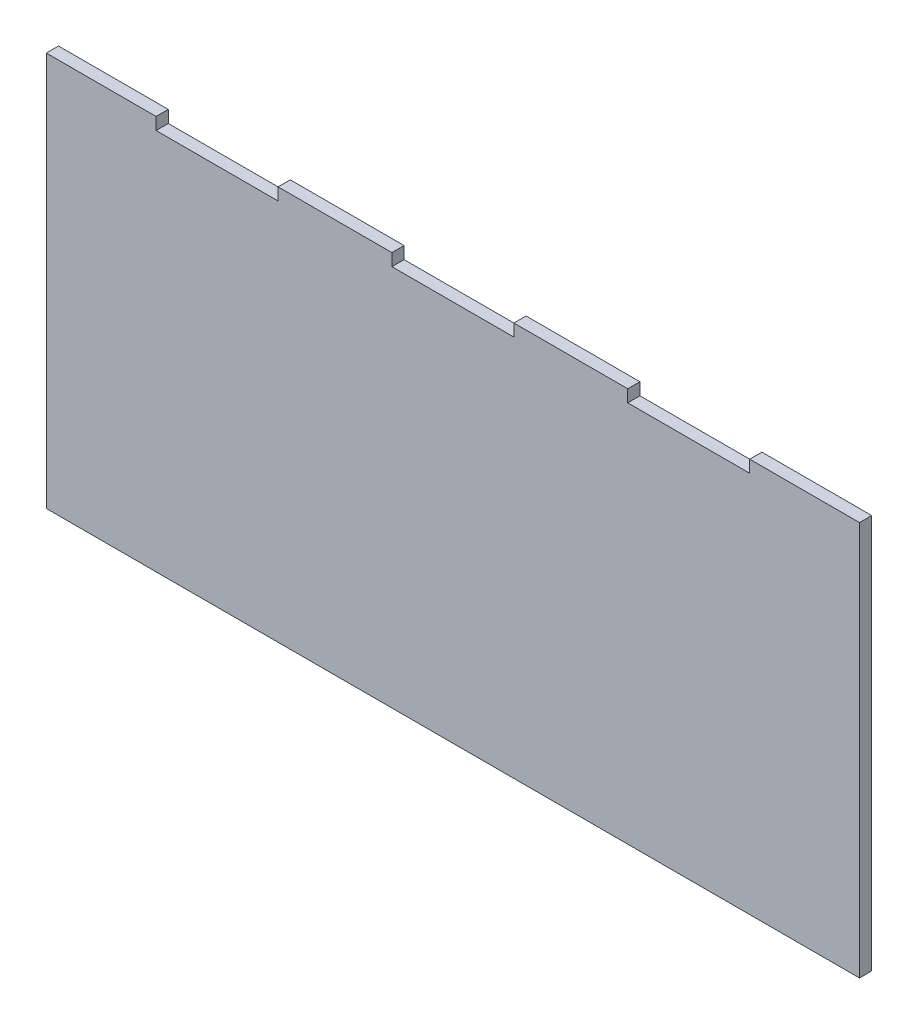
ISO-10303-21;
HEADER;
FILE_DESCRIPTION(('STEP AP214'),'2;1');
FILE_NAME('part.step','',(''),(''),'','','');
FILE_SCHEMA(('AUTOMOTIVE_DESIGN { 1 0 10303 214 1 1 1 1 }'));
ENDSEC;
DATA;
#1=APPLICATION_CONTEXT('core data for automotive mechanical design processes');
#2=APPLICATION_PROTOCOL_DEFINITION('international standard','automotive_design',2000,#1);
#3=PRODUCT_CONTEXT('',#1,'mechanical');
#4=PRODUCT('Part','Part','',(#3));
#5=PRODUCT_RELATED_PRODUCT_CATEGORY('part','',(#4));
#6=PRODUCT_DEFINITION_FORMATION('','',#4);
#7=PRODUCT_DEFINITION_CONTEXT('part definition',#1,'design');
#8=PRODUCT_DEFINITION('design','',#6,#7);
#9=PRODUCT_DEFINITION_SHAPE('','',#8);
#10=(LENGTH_UNIT() NAMED_UNIT(*) SI_UNIT(.MILLI.,.METRE.));
#11=(NAMED_UNIT(*) PLANE_ANGLE_UNIT() SI_UNIT($,.RADIAN.));
#12=(NAMED_UNIT(*) SI_UNIT($,.STERADIAN.) SOLID_ANGLE_UNIT());
#13=UNCERTAINTY_MEASURE_WITH_UNIT(LENGTH_MEASURE(1.E-05),#10,'distance_accuracy_value','');
#14=(GEOMETRIC_REPRESENTATION_CONTEXT(3) GLOBAL_UNCERTAINTY_ASSIGNED_CONTEXT((#13)) GLOBAL_UNIT_ASSIGNED_CONTEXT((#10,
#11,#12)) REPRESENTATION_CONTEXT('',''));
#15=CARTESIAN_POINT('',(0.,0.,0.));
#16=DIRECTION('',(0.,0.,1.));
#17=DIRECTION('',(1.,0.,0.));
#18=AXIS2_PLACEMENT_3D('',#15,#16,#17);
#19=CARTESIAN_POINT('',(-96.,42.0705102309501,3.));
#20=DIRECTION('',(0.,1.,0.));
#21=DIRECTION('',(0.,0.,1.));
#22=AXIS2_PLACEMENT_3D('',#19,#20,#21);
#23=PLANE('',#22);
#24=DIRECTION('',(1.,0.,0.));
#25=VECTOR('',#24,1.);
#26=CARTESIAN_POINT('',(-96.,42.0705102309501,0.));
#27=LINE('',#26,#25);
#28=CARTESIAN_POINT('',(-96.,42.0705102309501,0.));
#29=VERTEX_POINT('',#28);
#30=CARTESIAN_POINT('',(104.,42.0705102309501,0.));
#31=VERTEX_POINT('',#30);
#32=EDGE_CURVE('E188',#29,#31,#27,.T.);
#33=ORIENTED_EDGE('',*,*,#32,.T.);
#34=DIRECTION('',(0.,0.,-1.));
#35=VECTOR('',#34,1.);
#36=CARTESIAN_POINT('',(104.,42.0705102309501,3.));
#37=LINE('',#36,#35);
#38=CARTESIAN_POINT('',(104.,42.0705102309501,3.));
#39=VERTEX_POINT('',#38);
#40=EDGE_CURVE('E11',#39,#31,#37,.T.);
#41=ORIENTED_EDGE('',*,*,#40,.F.);
#42=DIRECTION('',(1.,0.,0.));
#43=VECTOR('',#42,1.);
#44=CARTESIAN_POINT('',(-96.,42.0705102309501,3.));
#45=LINE('',#44,#43);
#46=CARTESIAN_POINT('',(-96.,42.0705102309501,3.));
#47=VERTEX_POINT('',#46);
#48=EDGE_CURVE('E234',#47,#39,#45,.T.);
#49=ORIENTED_EDGE('',*,*,#48,.F.);
#50=DIRECTION('',(0.,0.,-1.));
#51=VECTOR('',#50,1.);
#52=CARTESIAN_POINT('',(-96.,42.0705102309501,3.));
#53=LINE('',#52,#51);
#54=EDGE_CURVE('E184',#47,#29,#53,.T.);
#55=ORIENTED_EDGE('',*,*,#54,.T.);
#56=EDGE_LOOP('',(#33,#41,#49,#55));
#57=FACE_BOUND('',#56,.T.);
#58=ADVANCED_FACE('F39',(#57),#23,.F.);
#59=CARTESIAN_POINT('',(104.,139.07051023095,3.));
#60=DIRECTION('',(-1.,0.,0.));
#61=DIRECTION('',(0.,0.,1.));
#62=AXIS2_PLACEMENT_3D('',#59,#60,#61);
#63=PLANE('',#62);
#64=DIRECTION('',(0.,1.,0.));
#65=VECTOR('',#64,1.);
#66=CARTESIAN_POINT('',(104.,139.07051023095,0.));
#67=LINE('',#66,#65);
#68=CARTESIAN_POINT('',(104.,139.07051023095,0.));
#69=VERTEX_POINT('',#68);
#70=EDGE_CURVE('E192',#31,#69,#67,.T.);
#71=ORIENTED_EDGE('',*,*,#70,.T.);
#72=DIRECTION('',(0.,0.,-1.));
#73=VECTOR('',#72,1.);
#74=CARTESIAN_POINT('',(104.,139.07051023095,3.));
#75=LINE('',#74,#73);
#76=CARTESIAN_POINT('',(104.,139.07051023095,3.));
#77=VERTEX_POINT('',#76);
#78=EDGE_CURVE('E48',#77,#69,#75,.T.);
#79=ORIENTED_EDGE('',*,*,#78,.F.);
#80=DIRECTION('',(0.,1.,0.));
#81=VECTOR('',#80,1.);
#82=CARTESIAN_POINT('',(104.,139.07051023095,3.));
#83=LINE('',#82,#81);
#84=EDGE_CURVE('E123',#39,#77,#83,.T.);
#85=ORIENTED_EDGE('',*,*,#84,.F.);
#86=ORIENTED_EDGE('',*,*,#40,.T.);
#87=EDGE_LOOP('',(#71,#79,#85,#86));
#88=FACE_BOUND('',#87,.T.);
#89=ADVANCED_FACE('F356',(#88),#63,.F.);
#90=CARTESIAN_POINT('',(77.,139.07051023095,3.));
#91=DIRECTION('',(0.,-1.,0.));
#92=DIRECTION('',(0.,0.,-1.));
#93=AXIS2_PLACEMENT_3D('',#90,#91,#92);
#94=PLANE('',#93);
#95=DIRECTION('',(-1.,0.,0.));
#96=VECTOR('',#95,1.);
#97=CARTESIAN_POINT('',(77.,139.07051023095,0.));
#98=LINE('',#97,#96);
#99=CARTESIAN_POINT('',(77.,139.07051023095,0.));
#100=VERTEX_POINT('',#99);
#101=EDGE_CURVE('E195',#69,#100,#98,.T.);
#102=ORIENTED_EDGE('',*,*,#101,.T.);
#103=DIRECTION('',(0.,0.,-1.));
#104=VECTOR('',#103,1.);
#105=CARTESIAN_POINT('',(77.,139.07051023095,3.));
#106=LINE('',#105,#104);
#107=CARTESIAN_POINT('',(77.,139.07051023095,3.));
#108=VERTEX_POINT('',#107);
#109=EDGE_CURVE('E277',#108,#100,#106,.T.);
#110=ORIENTED_EDGE('',*,*,#109,.F.);
#111=DIRECTION('',(-1.,0.,0.));
#112=VECTOR('',#111,1.);
#113=CARTESIAN_POINT('',(77.,139.07051023095,3.));
#114=LINE('',#113,#112);
#115=EDGE_CURVE('E287',#77,#108,#114,.T.);
#116=ORIENTED_EDGE('',*,*,#115,.F.);
#117=ORIENTED_EDGE('',*,*,#78,.T.);
#118=EDGE_LOOP('',(#102,#110,#116,#117));
#119=FACE_BOUND('',#118,.T.);
#120=ADVANCED_FACE('F285',(#119),#94,.F.);
#121=CARTESIAN_POINT('',(77.,139.07051023095,3.));
#122=DIRECTION('',(1.,0.,0.));
#123=DIRECTION('',(0.,0.,-1.));
#124=AXIS2_PLACEMENT_3D('',#121,#122,#123);
#125=PLANE('',#124);
#126=DIRECTION('',(0.,-1.,0.));
#127=VECTOR('',#126,1.);
#128=CARTESIAN_POINT('',(77.,139.07051023095,0.));
#129=LINE('',#128,#127);
#130=CARTESIAN_POINT('',(77.,136.07051023095,0.));
#131=VERTEX_POINT('',#130);
#132=EDGE_CURVE('E198',#100,#131,#129,.T.);
#133=ORIENTED_EDGE('',*,*,#132,.T.);
#134=DIRECTION('',(0.,0.,-1.));
#135=VECTOR('',#134,1.);
#136=CARTESIAN_POINT('',(77.,136.07051023095,3.));
#137=LINE('',#136,#135);
#138=CARTESIAN_POINT('',(77.,136.07051023095,3.));
#139=VERTEX_POINT('',#138);
#140=EDGE_CURVE('E273',#139,#131,#137,.T.);
#141=ORIENTED_EDGE('',*,*,#140,.F.);
#142=DIRECTION('',(0.,-1.,0.));
#143=VECTOR('',#142,1.);
#144=CARTESIAN_POINT('',(77.,139.07051023095,3.));
#145=LINE('',#144,#143);
#146=EDGE_CURVE('E306',#108,#139,#145,.T.);
#147=ORIENTED_EDGE('',*,*,#146,.F.);
#148=ORIENTED_EDGE('',*,*,#109,.T.);
#149=EDGE_LOOP('',(#133,#141,#147,#148));
#150=FACE_BOUND('',#149,.T.);
#151=ADVANCED_FACE('F296',(#150),#125,.F.);
#152=CARTESIAN_POINT('',(47.,136.07051023095,3.));
#153=DIRECTION('',(0.,-1.,0.));
#154=DIRECTION('',(0.,0.,-1.));
#155=AXIS2_PLACEMENT_3D('',#152,#153,#154);
#156=PLANE('',#155);
#157=DIRECTION('',(-1.,0.,0.));
#158=VECTOR('',#157,1.);
#159=CARTESIAN_POINT('',(47.,136.07051023095,0.));
#160=LINE('',#159,#158);
#161=CARTESIAN_POINT('',(47.,136.07051023095,0.));
#162=VERTEX_POINT('',#161);
#163=EDGE_CURVE('E201',#131,#162,#160,.T.);
#164=ORIENTED_EDGE('',*,*,#163,.T.);
#165=DIRECTION('',(0.,0.,-1.));
#166=VECTOR('',#165,1.);
#167=CARTESIAN_POINT('',(47.,136.07051023095,3.));
#168=LINE('',#167,#166);
#169=CARTESIAN_POINT('',(47.,136.07051023095,3.));
#170=VERTEX_POINT('',#169);
#171=EDGE_CURVE('E269',#170,#162,#168,.T.);
#172=ORIENTED_EDGE('',*,*,#171,.F.);
#173=DIRECTION('',(-1.,0.,0.));
#174=VECTOR('',#173,1.);
#175=CARTESIAN_POINT('',(47.,136.07051023095,3.));
#176=LINE('',#175,#174);
#177=EDGE_CURVE('E302',#139,#170,#176,.T.);
#178=ORIENTED_EDGE('',*,*,#177,.F.);
#179=ORIENTED_EDGE('',*,*,#140,.T.);
#180=EDGE_LOOP('',(#164,#172,#178,#179));
#181=FACE_BOUND('',#180,.T.);
#182=ADVANCED_FACE('F300',(#181),#156,.F.);
#183=CARTESIAN_POINT('',(47.,139.07051023095,3.));
#184=DIRECTION('',(-1.,0.,0.));
#185=DIRECTION('',(0.,0.,1.));
#186=AXIS2_PLACEMENT_3D('',#183,#184,#185);
#187=PLANE('',#186);
#188=DIRECTION('',(0.,1.,0.));
#189=VECTOR('',#188,1.);
#190=CARTESIAN_POINT('',(47.,139.07051023095,0.));
#191=LINE('',#190,#189);
#192=CARTESIAN_POINT('',(47.,139.07051023095,0.));
#193=VERTEX_POINT('',#192);
#194=EDGE_CURVE('E204',#162,#193,#191,.T.);
#195=ORIENTED_EDGE('',*,*,#194,.T.);
#196=DIRECTION('',(0.,0.,-1.));
#197=VECTOR('',#196,1.);
#198=CARTESIAN_POINT('',(47.,139.07051023095,3.));
#199=LINE('',#198,#197);
#200=CARTESIAN_POINT('',(47.,139.07051023095,3.));
#201=VERTEX_POINT('',#200);
#202=EDGE_CURVE('E265',#201,#193,#199,.T.);
#203=ORIENTED_EDGE('',*,*,#202,.F.);
#204=DIRECTION('',(0.,1.,0.));
#205=VECTOR('',#204,1.);
#206=CARTESIAN_POINT('',(47.,139.07051023095,3.));
#207=LINE('',#206,#205);
#208=EDGE_CURVE('E305',#170,#201,#207,.T.);
#209=ORIENTED_EDGE('',*,*,#208,.F.);
#210=ORIENTED_EDGE('',*,*,#171,.T.);
#211=EDGE_LOOP('',(#195,#203,#209,#210));
#212=FACE_BOUND('',#211,.T.);
#213=ADVANCED_FACE('F369',(#212),#187,.F.);
#214=CARTESIAN_POINT('',(19.,139.07051023095,3.));
#215=DIRECTION('',(0.,-1.,0.));
#216=DIRECTION('',(0.,0.,-1.));
#217=AXIS2_PLACEMENT_3D('',#214,#215,#216);
#218=PLANE('',#217);
#219=DIRECTION('',(-1.,0.,0.));
#220=VECTOR('',#219,1.);
#221=CARTESIAN_POINT('',(19.,139.07051023095,0.));
#222=LINE('',#221,#220);
#223=CARTESIAN_POINT('',(19.,139.07051023095,0.));
#224=VERTEX_POINT('',#223);
#225=EDGE_CURVE('E207',#193,#224,#222,.T.);
#226=ORIENTED_EDGE('',*,*,#225,.T.);
#227=DIRECTION('',(0.,0.,-1.));
#228=VECTOR('',#227,1.);
#229=CARTESIAN_POINT('',(19.,139.07051023095,3.));
#230=LINE('',#229,#228);
#231=CARTESIAN_POINT('',(19.,139.07051023095,3.));
#232=VERTEX_POINT('',#231);
#233=EDGE_CURVE('E261',#232,#224,#230,.T.);
#234=ORIENTED_EDGE('',*,*,#233,.F.);
#235=DIRECTION('',(-1.,0.,0.));
#236=VECTOR('',#235,1.);
#237=CARTESIAN_POINT('',(19.,139.07051023095,3.));
#238=LINE('',#237,#236);
#239=EDGE_CURVE('E310',#201,#232,#238,.T.);
#240=ORIENTED_EDGE('',*,*,#239,.F.);
#241=ORIENTED_EDGE('',*,*,#202,.T.);
#242=EDGE_LOOP('',(#226,#234,#240,#241));
#243=FACE_BOUND('',#242,.T.);
#244=ADVANCED_FACE('F372',(#243),#218,.F.);
#245=CARTESIAN_POINT('',(19.,139.07051023095,3.));
#246=DIRECTION('',(1.,0.,0.));
#247=DIRECTION('',(0.,0.,-1.));
#248=AXIS2_PLACEMENT_3D('',#245,#246,#247);
#249=PLANE('',#248);
#250=DIRECTION('',(0.,-1.,0.));
#251=VECTOR('',#250,1.);
#252=CARTESIAN_POINT('',(19.,139.07051023095,0.));
#253=LINE('',#252,#251);
#254=CARTESIAN_POINT('',(19.,136.07051023095,0.));
#255=VERTEX_POINT('',#254);
#256=EDGE_CURVE('E210',#224,#255,#253,.T.);
#257=ORIENTED_EDGE('',*,*,#256,.T.);
#258=DIRECTION('',(0.,0.,-1.));
#259=VECTOR('',#258,1.);
#260=CARTESIAN_POINT('',(19.,136.07051023095,3.));
#261=LINE('',#260,#259);
#262=CARTESIAN_POINT('',(19.,136.07051023095,3.));
#263=VERTEX_POINT('',#262);
#264=EDGE_CURVE('E257',#263,#255,#261,.T.);
#265=ORIENTED_EDGE('',*,*,#264,.F.);
#266=DIRECTION('',(0.,-1.,0.));
#267=VECTOR('',#266,1.);
#268=CARTESIAN_POINT('',(19.,139.07051023095,3.));
#269=LINE('',#268,#267);
#270=EDGE_CURVE('E317',#232,#263,#269,.T.);
#271=ORIENTED_EDGE('',*,*,#270,.F.);
#272=ORIENTED_EDGE('',*,*,#233,.T.);
#273=EDGE_LOOP('',(#257,#265,#271,#272));
#274=FACE_BOUND('',#273,.T.);
#275=ADVANCED_FACE('F376',(#274),#249,.F.);
#276=CARTESIAN_POINT('',(-11.,136.07051023095,3.));
#277=DIRECTION('',(0.,-1.,0.));
#278=DIRECTION('',(0.,0.,-1.));
#279=AXIS2_PLACEMENT_3D('',#276,#277,#278);
#280=PLANE('',#279);
#281=DIRECTION('',(-1.,0.,0.));
#282=VECTOR('',#281,1.);
#283=CARTESIAN_POINT('',(-11.,136.07051023095,0.));
#284=LINE('',#283,#282);
#285=CARTESIAN_POINT('',(-11.,136.07051023095,0.));
#286=VERTEX_POINT('',#285);
#287=EDGE_CURVE('E213',#255,#286,#284,.T.);
#288=ORIENTED_EDGE('',*,*,#287,.T.);
#289=DIRECTION('',(0.,0.,-1.));
#290=VECTOR('',#289,1.);
#291=CARTESIAN_POINT('',(-11.,136.07051023095,3.));
#292=LINE('',#291,#290);
#293=CARTESIAN_POINT('',(-11.,136.07051023095,3.));
#294=VERTEX_POINT('',#293);
#295=EDGE_CURVE('E253',#294,#286,#292,.T.);
#296=ORIENTED_EDGE('',*,*,#295,.F.);
#297=DIRECTION('',(-1.,0.,0.));
#298=VECTOR('',#297,1.);
#299=CARTESIAN_POINT('',(-11.,136.07051023095,3.));
#300=LINE('',#299,#298);
#301=EDGE_CURVE('E320',#263,#294,#300,.T.);
#302=ORIENTED_EDGE('',*,*,#301,.F.);
#303=ORIENTED_EDGE('',*,*,#264,.T.);
#304=EDGE_LOOP('',(#288,#296,#302,#303));
#305=FACE_BOUND('',#304,.T.);
#306=ADVANCED_FACE('F380',(#305),#280,.F.);
#307=CARTESIAN_POINT('',(-11.,139.07051023095,3.));
#308=DIRECTION('',(-1.,0.,0.));
#309=DIRECTION('',(0.,0.,1.));
#310=AXIS2_PLACEMENT_3D('',#307,#308,#309);
#311=PLANE('',#310);
#312=DIRECTION('',(0.,1.,0.));
#313=VECTOR('',#312,1.);
#314=CARTESIAN_POINT('',(-11.,139.07051023095,0.));
#315=LINE('',#314,#313);
#316=CARTESIAN_POINT('',(-11.,139.07051023095,0.));
#317=VERTEX_POINT('',#316);
#318=EDGE_CURVE('E216',#286,#317,#315,.T.);
#319=ORIENTED_EDGE('',*,*,#318,.T.);
#320=DIRECTION('',(0.,0.,-1.));
#321=VECTOR('',#320,1.);
#322=CARTESIAN_POINT('',(-11.,139.07051023095,3.));
#323=LINE('',#322,#321);
#324=CARTESIAN_POINT('',(-11.,139.07051023095,3.));
#325=VERTEX_POINT('',#324);
#326=EDGE_CURVE('E249',#325,#317,#323,.T.);
#327=ORIENTED_EDGE('',*,*,#326,.F.);
#328=DIRECTION('',(0.,1.,0.));
#329=VECTOR('',#328,1.);
#330=CARTESIAN_POINT('',(-11.,139.07051023095,3.));
#331=LINE('',#330,#329);
#332=EDGE_CURVE('E323',#294,#325,#331,.T.);
#333=ORIENTED_EDGE('',*,*,#332,.F.);
#334=ORIENTED_EDGE('',*,*,#295,.T.);
#335=EDGE_LOOP('',(#319,#327,#333,#334));
#336=FACE_BOUND('',#335,.T.);
#337=ADVANCED_FACE('F384',(#336),#311,.F.);
#338=CARTESIAN_POINT('',(-39.,139.07051023095,3.));
#339=DIRECTION('',(0.,-1.,0.));
#340=DIRECTION('',(0.,0.,-1.));
#341=AXIS2_PLACEMENT_3D('',#338,#339,#340);
#342=PLANE('',#341);
#343=DIRECTION('',(-1.,0.,0.));
#344=VECTOR('',#343,1.);
#345=CARTESIAN_POINT('',(-39.,139.07051023095,0.));
#346=LINE('',#345,#344);
#347=CARTESIAN_POINT('',(-39.,139.07051023095,0.));
#348=VERTEX_POINT('',#347);
#349=EDGE_CURVE('E219',#317,#348,#346,.T.);
#350=ORIENTED_EDGE('',*,*,#349,.T.);
#351=DIRECTION('',(0.,0.,-1.));
#352=VECTOR('',#351,1.);
#353=CARTESIAN_POINT('',(-39.,139.07051023095,3.));
#354=LINE('',#353,#352);
#355=CARTESIAN_POINT('',(-39.,139.07051023095,3.));
#356=VERTEX_POINT('',#355);
#357=EDGE_CURVE('E245',#356,#348,#354,.T.);
#358=ORIENTED_EDGE('',*,*,#357,.F.);
#359=DIRECTION('',(-1.,0.,0.));
#360=VECTOR('',#359,1.);
#361=CARTESIAN_POINT('',(-39.,139.07051023095,3.));
#362=LINE('',#361,#360);
#363=EDGE_CURVE('E326',#325,#356,#362,.T.);
#364=ORIENTED_EDGE('',*,*,#363,.F.);
#365=ORIENTED_EDGE('',*,*,#326,.T.);
#366=EDGE_LOOP('',(#350,#358,#364,#365));
#367=FACE_BOUND('',#366,.T.);
#368=ADVANCED_FACE('F388',(#367),#342,.F.);
#369=CARTESIAN_POINT('',(-39.,139.07051023095,3.));
#370=DIRECTION('',(1.,0.,0.));
#371=DIRECTION('',(0.,0.,-1.));
#372=AXIS2_PLACEMENT_3D('',#369,#370,#371);
#373=PLANE('',#372);
#374=DIRECTION('',(0.,-1.,0.));
#375=VECTOR('',#374,1.);
#376=CARTESIAN_POINT('',(-39.,139.07051023095,0.));
#377=LINE('',#376,#375);
#378=CARTESIAN_POINT('',(-39.,136.07051023095,0.));
#379=VERTEX_POINT('',#378);
#380=EDGE_CURVE('E222',#348,#379,#377,.T.);
#381=ORIENTED_EDGE('',*,*,#380,.T.);
#382=DIRECTION('',(0.,0.,-1.));
#383=VECTOR('',#382,1.);
#384=CARTESIAN_POINT('',(-39.,136.07051023095,3.));
#385=LINE('',#384,#383);
#386=CARTESIAN_POINT('',(-39.,136.07051023095,3.));
#387=VERTEX_POINT('',#386);
#388=EDGE_CURVE('E241',#387,#379,#385,.T.);
#389=ORIENTED_EDGE('',*,*,#388,.F.);
#390=DIRECTION('',(0.,-1.,0.));
#391=VECTOR('',#390,1.);
#392=CARTESIAN_POINT('',(-39.,139.07051023095,3.));
#393=LINE('',#392,#391);
#394=EDGE_CURVE('E329',#356,#387,#393,.T.);
#395=ORIENTED_EDGE('',*,*,#394,.F.);
#396=ORIENTED_EDGE('',*,*,#357,.T.);
#397=EDGE_LOOP('',(#381,#389,#395,#396));
#398=FACE_BOUND('',#397,.T.);
#399=ADVANCED_FACE('F337',(#398),#373,.F.);
#400=CARTESIAN_POINT('',(-69.,136.07051023095,3.));
#401=DIRECTION('',(0.,-1.,0.));
#402=DIRECTION('',(0.,0.,-1.));
#403=AXIS2_PLACEMENT_3D('',#400,#401,#402);
#404=PLANE('',#403);
#405=DIRECTION('',(-1.,0.,0.));
#406=VECTOR('',#405,1.);
#407=CARTESIAN_POINT('',(-69.,136.07051023095,0.));
#408=LINE('',#407,#406);
#409=CARTESIAN_POINT('',(-69.,136.07051023095,0.));
#410=VERTEX_POINT('',#409);
#411=EDGE_CURVE('E225',#379,#410,#408,.T.);
#412=ORIENTED_EDGE('',*,*,#411,.T.);
#413=DIRECTION('',(0.,0.,-1.));
#414=VECTOR('',#413,1.);
#415=CARTESIAN_POINT('',(-69.,136.07051023095,3.));
#416=LINE('',#415,#414);
#417=CARTESIAN_POINT('',(-69.,136.07051023095,3.));
#418=VERTEX_POINT('',#417);
#419=EDGE_CURVE('E177',#418,#410,#416,.T.);
#420=ORIENTED_EDGE('',*,*,#419,.F.);
#421=DIRECTION('',(-1.,0.,0.));
#422=VECTOR('',#421,1.);
#423=CARTESIAN_POINT('',(-69.,136.07051023095,3.));
#424=LINE('',#423,#422);
#425=EDGE_CURVE('E166',#387,#418,#424,.T.);
#426=ORIENTED_EDGE('',*,*,#425,.F.);
#427=ORIENTED_EDGE('',*,*,#388,.T.);
#428=EDGE_LOOP('',(#412,#420,#426,#427));
#429=FACE_BOUND('',#428,.T.);
#430=ADVANCED_FACE('F341',(#429),#404,.F.);
#431=CARTESIAN_POINT('',(-69.,139.07051023095,3.));
#432=DIRECTION('',(-1.,0.,0.));
#433=DIRECTION('',(0.,0.,1.));
#434=AXIS2_PLACEMENT_3D('',#431,#432,#433);
#435=PLANE('',#434);
#436=DIRECTION('',(0.,1.,0.));
#437=VECTOR('',#436,1.);
#438=CARTESIAN_POINT('',(-69.,139.07051023095,0.));
#439=LINE('',#438,#437);
#440=CARTESIAN_POINT('',(-69.,139.07051023095,0.));
#441=VERTEX_POINT('',#440);
#442=EDGE_CURVE('E175',#410,#441,#439,.T.);
#443=ORIENTED_EDGE('',*,*,#442,.T.);
#444=DIRECTION('',(0.,0.,-1.));
#445=VECTOR('',#444,1.);
#446=CARTESIAN_POINT('',(-69.,139.07051023095,3.));
#447=LINE('',#446,#445);
#448=CARTESIAN_POINT('',(-69.,139.07051023095,3.));
#449=VERTEX_POINT('',#448);
#450=EDGE_CURVE('E172',#449,#441,#447,.T.);
#451=ORIENTED_EDGE('',*,*,#450,.F.);
#452=DIRECTION('',(0.,1.,0.));
#453=VECTOR('',#452,1.);
#454=CARTESIAN_POINT('',(-69.,139.07051023095,3.));
#455=LINE('',#454,#453);
#456=EDGE_CURVE('E160',#418,#449,#455,.T.);
#457=ORIENTED_EDGE('',*,*,#456,.F.);
#458=ORIENTED_EDGE('',*,*,#419,.T.);
#459=EDGE_LOOP('',(#443,#451,#457,#458));
#460=FACE_BOUND('',#459,.T.);
#461=ADVANCED_FACE('F173',(#460),#435,.F.);
#462=CARTESIAN_POINT('',(-96.,139.07051023095,3.));
#463=DIRECTION('',(0.,-1.,0.));
#464=DIRECTION('',(0.,0.,-1.));
#465=AXIS2_PLACEMENT_3D('',#462,#463,#464);
#466=PLANE('',#465);
#467=DIRECTION('',(-1.,0.,0.));
#468=VECTOR('',#467,1.);
#469=CARTESIAN_POINT('',(-96.,139.07051023095,0.));
#470=LINE('',#469,#468);
#471=CARTESIAN_POINT('',(-96.,139.07051023095,0.));
#472=VERTEX_POINT('',#471);
#473=EDGE_CURVE('E109',#441,#472,#470,.T.);
#474=ORIENTED_EDGE('',*,*,#473,.T.);
#475=DIRECTION('',(0.,0.,-1.));
#476=VECTOR('',#475,1.);
#477=CARTESIAN_POINT('',(-96.,139.07051023095,3.));
#478=LINE('',#477,#476);
#479=CARTESIAN_POINT('',(-96.,139.07051023095,3.));
#480=VERTEX_POINT('',#479);
#481=EDGE_CURVE('E178',#480,#472,#478,.T.);
#482=ORIENTED_EDGE('',*,*,#481,.F.);
#483=DIRECTION('',(-1.,0.,0.));
#484=VECTOR('',#483,1.);
#485=CARTESIAN_POINT('',(-96.,139.07051023095,3.));
#486=LINE('',#485,#484);
#487=EDGE_CURVE('E164',#449,#480,#486,.T.);
#488=ORIENTED_EDGE('',*,*,#487,.F.);
#489=ORIENTED_EDGE('',*,*,#450,.T.);
#490=EDGE_LOOP('',(#474,#482,#488,#489));
#491=FACE_BOUND('',#490,.T.);
#492=ADVANCED_FACE('F180',(#491),#466,.F.);
#493=CARTESIAN_POINT('',(-96.,139.07051023095,3.));
#494=DIRECTION('',(1.,0.,0.));
#495=DIRECTION('',(0.,0.,-1.));
#496=AXIS2_PLACEMENT_3D('',#493,#494,#495);
#497=PLANE('',#496);
#498=DIRECTION('',(0.,-1.,0.));
#499=VECTOR('',#498,1.);
#500=CARTESIAN_POINT('',(-96.,139.07051023095,0.));
#501=LINE('',#500,#499);
#502=EDGE_CURVE('E115',#472,#29,#501,.T.);
#503=ORIENTED_EDGE('',*,*,#502,.T.);
#504=ORIENTED_EDGE('',*,*,#54,.F.);
#505=DIRECTION('',(0.,-1.,0.));
#506=VECTOR('',#505,1.);
#507=CARTESIAN_POINT('',(-96.,139.07051023095,3.));
#508=LINE('',#507,#506);
#509=EDGE_CURVE('E56',#480,#47,#508,.T.);
#510=ORIENTED_EDGE('',*,*,#509,.F.);
#511=ORIENTED_EDGE('',*,*,#481,.T.);
#512=EDGE_LOOP('',(#503,#504,#510,#511));
#513=FACE_BOUND('',#512,.T.);
#514=ADVANCED_FACE('F345',(#513),#497,.F.);
#515=CARTESIAN_POINT('',(0.,0.,3.));
#516=DIRECTION('',(0.,0.,-1.));
#517=DIRECTION('',(-1.,0.,0.));
#518=AXIS2_PLACEMENT_3D('',#515,#516,#517);
#519=PLANE('',#518);
#520=ORIENTED_EDGE('',*,*,#48,.T.);
#521=ORIENTED_EDGE('',*,*,#84,.T.);
#522=ORIENTED_EDGE('',*,*,#115,.T.);
#523=ORIENTED_EDGE('',*,*,#146,.T.);
#524=ORIENTED_EDGE('',*,*,#177,.T.);
#525=ORIENTED_EDGE('',*,*,#208,.T.);
#526=ORIENTED_EDGE('',*,*,#239,.T.);
#527=ORIENTED_EDGE('',*,*,#270,.T.);
#528=ORIENTED_EDGE('',*,*,#301,.T.);
#529=ORIENTED_EDGE('',*,*,#332,.T.);
#530=ORIENTED_EDGE('',*,*,#363,.T.);
#531=ORIENTED_EDGE('',*,*,#394,.T.);
#532=ORIENTED_EDGE('',*,*,#425,.T.);
#533=ORIENTED_EDGE('',*,*,#456,.T.);
#534=ORIENTED_EDGE('',*,*,#487,.T.);
#535=ORIENTED_EDGE('',*,*,#509,.T.);
#536=EDGE_LOOP('',(#520,#521,#522,#523,#524,#525,#526,#527,#528,#529,#530,#531,#532,#533,#534,#535));
#537=FACE_BOUND('',#536,.T.);
#538=ADVANCED_FACE('F162',(#537),#519,.F.);
#539=CARTESIAN_POINT('',(0.,0.,0.));
#540=DIRECTION('',(0.,0.,-1.));
#541=DIRECTION('',(-1.,0.,0.));
#542=AXIS2_PLACEMENT_3D('',#539,#540,#541);
#543=PLANE('',#542);
#544=ORIENTED_EDGE('',*,*,#32,.F.);
#545=ORIENTED_EDGE('',*,*,#502,.F.);
#546=ORIENTED_EDGE('',*,*,#473,.F.);
#547=ORIENTED_EDGE('',*,*,#442,.F.);
#548=ORIENTED_EDGE('',*,*,#411,.F.);
#549=ORIENTED_EDGE('',*,*,#380,.F.);
#550=ORIENTED_EDGE('',*,*,#349,.F.);
#551=ORIENTED_EDGE('',*,*,#318,.F.);
#552=ORIENTED_EDGE('',*,*,#287,.F.);
#553=ORIENTED_EDGE('',*,*,#256,.F.);
#554=ORIENTED_EDGE('',*,*,#225,.F.);
#555=ORIENTED_EDGE('',*,*,#194,.F.);
#556=ORIENTED_EDGE('',*,*,#163,.F.);
#557=ORIENTED_EDGE('',*,*,#132,.F.);
#558=ORIENTED_EDGE('',*,*,#101,.F.);
#559=ORIENTED_EDGE('',*,*,#70,.F.);
#560=EDGE_LOOP('',(#544,#545,#546,#547,#548,#549,#550,#551,#552,#553,#554,#555,#556,#557,#558,#559));
#561=FACE_BOUND('',#560,.T.);
#562=ADVANCED_FACE('F291',(#561),#543,.T.);
#563=CLOSED_SHELL('',(#58,#89,#120,#151,#182,#213,#244,#275,#306,#337,#368,#399,#430,#461,#492,
#514,#538,#562));
#564=MANIFOLD_SOLID_BREP('B2',#563);
#565=ADVANCED_BREP_SHAPE_REPRESENTATION('',(#18,#564),#14);
#566=SHAPE_DEFINITION_REPRESENTATION(#9,#565);
ENDSEC;
END-ISO-10303-21;
